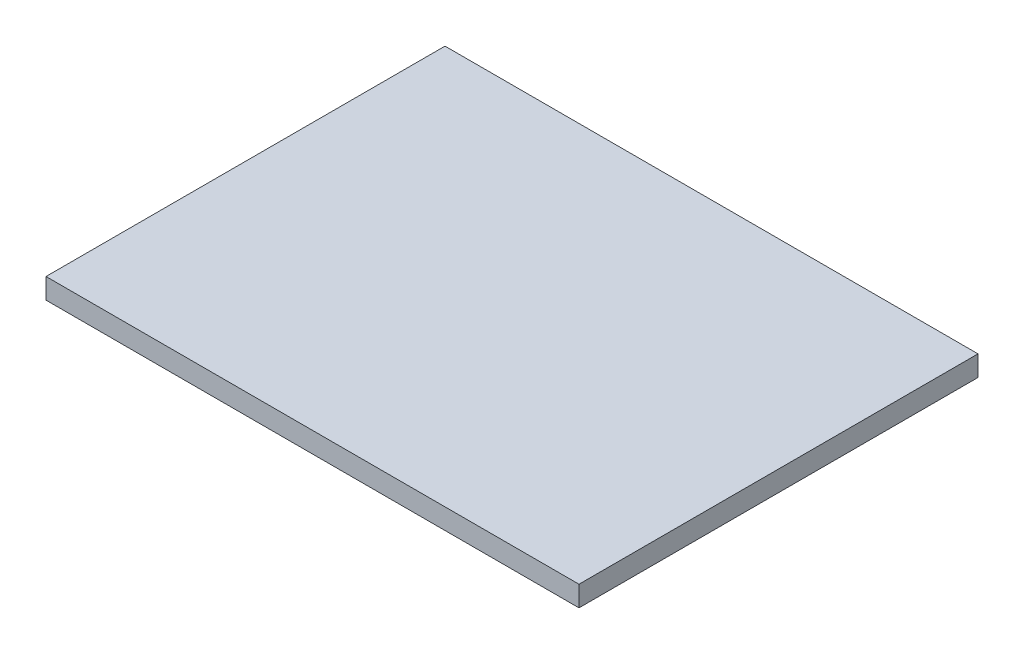
ISO-10303-21;
HEADER;
FILE_DESCRIPTION(('STEP AP214'),'2;1');
FILE_NAME('part.step','',(''),(''),'','','');
FILE_SCHEMA(('AUTOMOTIVE_DESIGN { 1 0 10303 214 1 1 1 1 }'));
ENDSEC;
DATA;
#1=APPLICATION_CONTEXT('core data for automotive mechanical design processes');
#2=APPLICATION_PROTOCOL_DEFINITION('international standard','automotive_design',2000,#1);
#3=PRODUCT_CONTEXT('',#1,'mechanical');
#4=PRODUCT('Part','Part','',(#3));
#5=PRODUCT_RELATED_PRODUCT_CATEGORY('part','',(#4));
#6=PRODUCT_DEFINITION_FORMATION('','',#4);
#7=PRODUCT_DEFINITION_CONTEXT('part definition',#1,'design');
#8=PRODUCT_DEFINITION('design','',#6,#7);
#9=PRODUCT_DEFINITION_SHAPE('','',#8);
#10=(LENGTH_UNIT() NAMED_UNIT(*) SI_UNIT(.MILLI.,.METRE.));
#11=(NAMED_UNIT(*) PLANE_ANGLE_UNIT() SI_UNIT($,.RADIAN.));
#12=(NAMED_UNIT(*) SI_UNIT($,.STERADIAN.) SOLID_ANGLE_UNIT());
#13=UNCERTAINTY_MEASURE_WITH_UNIT(LENGTH_MEASURE(1.E-05),#10,'distance_accuracy_value','');
#14=(GEOMETRIC_REPRESENTATION_CONTEXT(3) GLOBAL_UNCERTAINTY_ASSIGNED_CONTEXT((#13)) GLOBAL_UNIT_ASSIGNED_CONTEXT((#10,
#11,#12)) REPRESENTATION_CONTEXT('',''));
#15=CARTESIAN_POINT('',(0.,0.,0.));
#16=DIRECTION('',(0.,0.,1.));
#17=DIRECTION('',(1.,0.,0.));
#18=AXIS2_PLACEMENT_3D('',#15,#16,#17);
#19=CARTESIAN_POINT('',(130.,10.,97.318555));
#20=DIRECTION('',(-1.,0.,0.));
#21=DIRECTION('',(0.,0.,1.));
#22=AXIS2_PLACEMENT_3D('',#19,#20,#21);
#23=PLANE('',#22);
#24=DIRECTION('',(0.,0.,-1.));
#25=VECTOR('',#24,1.);
#26=CARTESIAN_POINT('',(130.,0.,97.318555));
#27=LINE('',#26,#25);
#28=CARTESIAN_POINT('',(130.,0.,97.318555));
#29=VERTEX_POINT('',#28);
#30=CARTESIAN_POINT('',(130.,0.,-97.318555));
#31=VERTEX_POINT('',#30);
#32=EDGE_CURVE('E100',#29,#31,#27,.T.);
#33=ORIENTED_EDGE('',*,*,#32,.T.);
#34=DIRECTION('',(0.,-1.,0.));
#35=VECTOR('',#34,1.);
#36=CARTESIAN_POINT('',(130.,10.,-97.318555));
#37=LINE('',#36,#35);
#38=CARTESIAN_POINT('',(130.,10.,-97.318555));
#39=VERTEX_POINT('',#38);
#40=EDGE_CURVE('E11',#39,#31,#37,.T.);
#41=ORIENTED_EDGE('',*,*,#40,.F.);
#42=DIRECTION('',(0.,0.,-1.));
#43=VECTOR('',#42,1.);
#44=CARTESIAN_POINT('',(130.,10.,97.318555));
#45=LINE('',#44,#43);
#46=CARTESIAN_POINT('',(130.,10.,97.318555));
#47=VERTEX_POINT('',#46);
#48=EDGE_CURVE('E88',#47,#39,#45,.T.);
#49=ORIENTED_EDGE('',*,*,#48,.F.);
#50=DIRECTION('',(0.,-1.,0.));
#51=VECTOR('',#50,1.);
#52=CARTESIAN_POINT('',(130.,10.,97.318555));
#53=LINE('',#52,#51);
#54=EDGE_CURVE('E96',#47,#29,#53,.T.);
#55=ORIENTED_EDGE('',*,*,#54,.T.);
#56=EDGE_LOOP('',(#33,#41,#49,#55));
#57=FACE_BOUND('',#56,.T.);
#58=ADVANCED_FACE('F37',(#57),#23,.F.);
#59=CARTESIAN_POINT('',(-130.,10.,-97.318555));
#60=DIRECTION('',(0.,0.,1.));
#61=DIRECTION('',(1.,0.,0.));
#62=AXIS2_PLACEMENT_3D('',#59,#60,#61);
#63=PLANE('',#62);
#64=DIRECTION('',(-1.,0.,0.));
#65=VECTOR('',#64,1.);
#66=CARTESIAN_POINT('',(-130.,0.,-97.318555));
#67=LINE('',#66,#65);
#68=CARTESIAN_POINT('',(-130.,0.,-97.318555));
#69=VERTEX_POINT('',#68);
#70=EDGE_CURVE('E92',#31,#69,#67,.T.);
#71=ORIENTED_EDGE('',*,*,#70,.T.);
#72=DIRECTION('',(0.,-1.,0.));
#73=VECTOR('',#72,1.);
#74=CARTESIAN_POINT('',(-130.,10.,-97.318555));
#75=LINE('',#74,#73);
#76=CARTESIAN_POINT('',(-130.,10.,-97.318555));
#77=VERTEX_POINT('',#76);
#78=EDGE_CURVE('E45',#77,#69,#75,.T.);
#79=ORIENTED_EDGE('',*,*,#78,.F.);
#80=DIRECTION('',(-1.,0.,0.));
#81=VECTOR('',#80,1.);
#82=CARTESIAN_POINT('',(-130.,10.,-97.318555));
#83=LINE('',#82,#81);
#84=EDGE_CURVE('E83',#39,#77,#83,.T.);
#85=ORIENTED_EDGE('',*,*,#84,.F.);
#86=ORIENTED_EDGE('',*,*,#40,.T.);
#87=EDGE_LOOP('',(#71,#79,#85,#86));
#88=FACE_BOUND('',#87,.T.);
#89=ADVANCED_FACE('F91',(#88),#63,.F.);
#90=CARTESIAN_POINT('',(-130.,10.,97.318555));
#91=DIRECTION('',(1.,0.,0.));
#92=DIRECTION('',(0.,0.,-1.));
#93=AXIS2_PLACEMENT_3D('',#90,#91,#92);
#94=PLANE('',#93);
#95=DIRECTION('',(0.,0.,1.));
#96=VECTOR('',#95,1.);
#97=CARTESIAN_POINT('',(-130.,0.,97.318555));
#98=LINE('',#97,#96);
#99=CARTESIAN_POINT('',(-130.,0.,97.318555));
#100=VERTEX_POINT('',#99);
#101=EDGE_CURVE('E70',#69,#100,#98,.T.);
#102=ORIENTED_EDGE('',*,*,#101,.T.);
#103=DIRECTION('',(0.,-1.,0.));
#104=VECTOR('',#103,1.);
#105=CARTESIAN_POINT('',(-130.,10.,97.318555));
#106=LINE('',#105,#104);
#107=CARTESIAN_POINT('',(-130.,10.,97.318555));
#108=VERTEX_POINT('',#107);
#109=EDGE_CURVE('E93',#108,#100,#106,.T.);
#110=ORIENTED_EDGE('',*,*,#109,.F.);
#111=DIRECTION('',(0.,0.,1.));
#112=VECTOR('',#111,1.);
#113=CARTESIAN_POINT('',(-130.,10.,97.318555));
#114=LINE('',#113,#112);
#115=EDGE_CURVE('E86',#77,#108,#114,.T.);
#116=ORIENTED_EDGE('',*,*,#115,.F.);
#117=ORIENTED_EDGE('',*,*,#78,.T.);
#118=EDGE_LOOP('',(#102,#110,#116,#117));
#119=FACE_BOUND('',#118,.T.);
#120=ADVANCED_FACE('F94',(#119),#94,.F.);
#121=CARTESIAN_POINT('',(-130.,10.,97.318555));
#122=DIRECTION('',(0.,0.,-1.));
#123=DIRECTION('',(-1.,0.,0.));
#124=AXIS2_PLACEMENT_3D('',#121,#122,#123);
#125=PLANE('',#124);
#126=DIRECTION('',(1.,0.,0.));
#127=VECTOR('',#126,1.);
#128=CARTESIAN_POINT('',(-130.,0.,97.318555));
#129=LINE('',#128,#127);
#130=EDGE_CURVE('E76',#100,#29,#129,.T.);
#131=ORIENTED_EDGE('',*,*,#130,.T.);
#132=ORIENTED_EDGE('',*,*,#54,.F.);
#133=DIRECTION('',(1.,0.,0.));
#134=VECTOR('',#133,1.);
#135=CARTESIAN_POINT('',(-130.,10.,97.318555));
#136=LINE('',#135,#134);
#137=EDGE_CURVE('E53',#108,#47,#136,.T.);
#138=ORIENTED_EDGE('',*,*,#137,.F.);
#139=ORIENTED_EDGE('',*,*,#109,.T.);
#140=EDGE_LOOP('',(#131,#132,#138,#139));
#141=FACE_BOUND('',#140,.T.);
#142=ADVANCED_FACE('F107',(#141),#125,.F.);
#143=CARTESIAN_POINT('',(0.,10.,0.));
#144=DIRECTION('',(0.,-1.,0.));
#145=DIRECTION('',(0.,0.,-1.));
#146=AXIS2_PLACEMENT_3D('',#143,#144,#145);
#147=PLANE('',#146);
#148=ORIENTED_EDGE('',*,*,#48,.T.);
#149=ORIENTED_EDGE('',*,*,#84,.T.);
#150=ORIENTED_EDGE('',*,*,#115,.T.);
#151=ORIENTED_EDGE('',*,*,#137,.T.);
#152=EDGE_LOOP('',(#148,#149,#150,#151));
#153=FACE_BOUND('',#152,.T.);
#154=ADVANCED_FACE('F84',(#153),#147,.F.);
#155=CARTESIAN_POINT('',(0.,0.,0.));
#156=DIRECTION('',(0.,-1.,0.));
#157=DIRECTION('',(0.,0.,-1.));
#158=AXIS2_PLACEMENT_3D('',#155,#156,#157);
#159=PLANE('',#158);
#160=ORIENTED_EDGE('',*,*,#32,.F.);
#161=ORIENTED_EDGE('',*,*,#130,.F.);
#162=ORIENTED_EDGE('',*,*,#101,.F.);
#163=ORIENTED_EDGE('',*,*,#70,.F.);
#164=EDGE_LOOP('',(#160,#161,#162,#163));
#165=FACE_BOUND('',#164,.T.);
#166=ADVANCED_FACE('F110',(#165),#159,.T.);
#167=CLOSED_SHELL('',(#58,#89,#120,#142,#154,#166));
#168=MANIFOLD_SOLID_BREP('B2',#167);
#169=ADVANCED_BREP_SHAPE_REPRESENTATION('',(#18,#168),#14);
#170=SHAPE_DEFINITION_REPRESENTATION(#9,#169);
ENDSEC;
END-ISO-10303-21;
